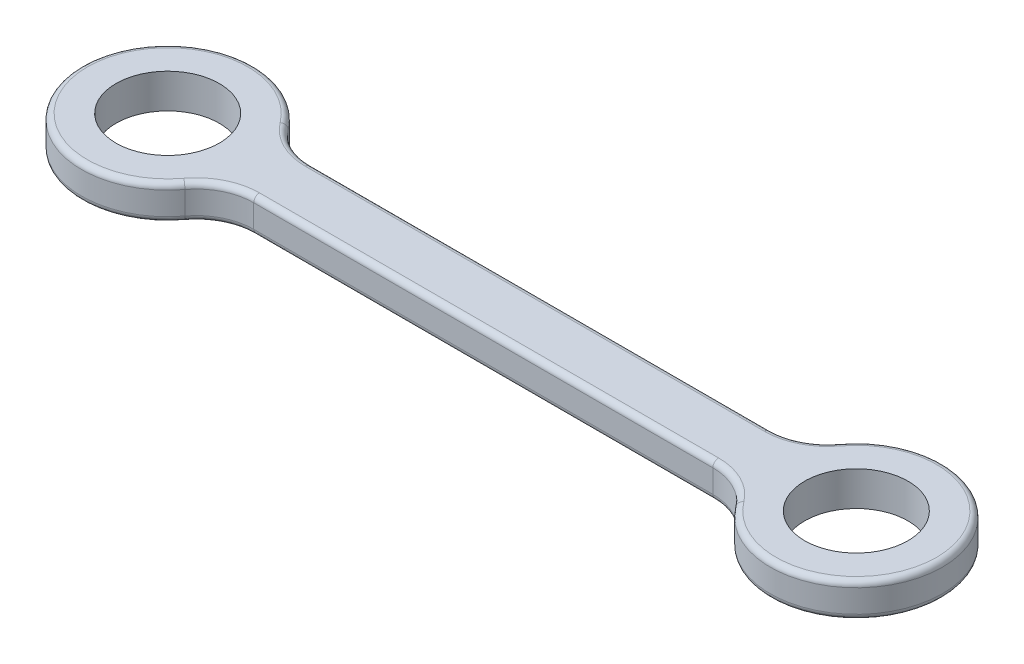
ISO-10303-21;
HEADER;
FILE_DESCRIPTION(('STEP AP214'),'2;1');
FILE_NAME('part.step','',(''),(''),'','','');
FILE_SCHEMA(('AUTOMOTIVE_DESIGN { 1 0 10303 214 1 1 1 1 }'));
ENDSEC;
DATA;
#1=APPLICATION_CONTEXT('core data for automotive mechanical design processes');
#2=APPLICATION_PROTOCOL_DEFINITION('international standard','automotive_design',2000,#1);
#3=PRODUCT_CONTEXT('',#1,'mechanical');
#4=PRODUCT('Part','Part','',(#3));
#5=PRODUCT_RELATED_PRODUCT_CATEGORY('part','',(#4));
#6=PRODUCT_DEFINITION_FORMATION('','',#4);
#7=PRODUCT_DEFINITION_CONTEXT('part definition',#1,'design');
#8=PRODUCT_DEFINITION('design','',#6,#7);
#9=PRODUCT_DEFINITION_SHAPE('','',#8);
#10=(LENGTH_UNIT() NAMED_UNIT(*) SI_UNIT(.MILLI.,.METRE.));
#11=(NAMED_UNIT(*) PLANE_ANGLE_UNIT() SI_UNIT($,.RADIAN.));
#12=(NAMED_UNIT(*) SI_UNIT($,.STERADIAN.) SOLID_ANGLE_UNIT());
#13=UNCERTAINTY_MEASURE_WITH_UNIT(LENGTH_MEASURE(1.E-05),#10,'distance_accuracy_value','');
#14=(GEOMETRIC_REPRESENTATION_CONTEXT(3) GLOBAL_UNCERTAINTY_ASSIGNED_CONTEXT((#13)) GLOBAL_UNIT_ASSIGNED_CONTEXT((#10,
#11,#12)) REPRESENTATION_CONTEXT('',''));
#15=CARTESIAN_POINT('',(0.,0.,0.));
#16=DIRECTION('',(0.,0.,1.));
#17=DIRECTION('',(1.,0.,0.));
#18=AXIS2_PLACEMENT_3D('',#15,#16,#17);
#19=CARTESIAN_POINT('',(51.9540229885057,6.,-15.));
#20=DIRECTION('',(0.,-1.,0.));
#21=DIRECTION('',(0.,0.,-1.));
#22=AXIS2_PLACEMENT_3D('',#19,#20,#21);
#23=PLANE('',#22);
#24=CARTESIAN_POINT('',(-48.0459770114942,6.,0.));
#25=DIRECTION('',(0.,-1.,0.));
#26=DIRECTION('',(0.,0.,-1.));
#27=AXIS2_PLACEMENT_3D('',#24,#25,#26);
#28=CIRCLE('',#27,14.);
#29=CARTESIAN_POINT('',(-36.8459770114942,6.,-8.4));
#30=VERTEX_POINT('',#29);
#31=CARTESIAN_POINT('',(-36.8459770114942,6.,8.4));
#32=VERTEX_POINT('',#31);
#33=EDGE_CURVE('E57',#30,#32,#28,.F.);
#34=ORIENTED_EDGE('',*,*,#33,.T.);
#35=CARTESIAN_POINT('',(-28.0459770114942,6.,15.));
#36=DIRECTION('',(0.,-1.,0.));
#37=DIRECTION('',(0.,0.,-1.));
#38=AXIS2_PLACEMENT_3D('',#35,#36,#37);
#39=CIRCLE('',#38,11.);
#40=CARTESIAN_POINT('',(-28.0459770114942,6.,4.));
#41=VERTEX_POINT('',#40);
#42=EDGE_CURVE('E159',#32,#41,#39,.T.);
#43=ORIENTED_EDGE('',*,*,#42,.T.);
#44=DIRECTION('',(1.,0.,0.));
#45=VECTOR('',#44,1.);
#46=CARTESIAN_POINT('',(51.9540229885057,6.,4.));
#47=LINE('',#46,#45);
#48=CARTESIAN_POINT('',(51.9540229885057,6.,4.));
#49=VERTEX_POINT('',#48);
#50=EDGE_CURVE('E267',#41,#49,#47,.T.);
#51=ORIENTED_EDGE('',*,*,#50,.T.);
#52=CARTESIAN_POINT('',(51.9540229885057,6.,15.));
#53=DIRECTION('',(0.,-1.,0.));
#54=DIRECTION('',(0.,0.,-1.));
#55=AXIS2_PLACEMENT_3D('',#52,#53,#54);
#56=CIRCLE('',#55,11.);
#57=CARTESIAN_POINT('',(60.7540229885058,6.,8.4));
#58=VERTEX_POINT('',#57);
#59=EDGE_CURVE('E270',#49,#58,#56,.T.);
#60=ORIENTED_EDGE('',*,*,#59,.T.);
#61=CARTESIAN_POINT('',(71.9540229885058,6.,0.));
#62=DIRECTION('',(0.,-1.,0.));
#63=DIRECTION('',(0.,0.,-1.));
#64=AXIS2_PLACEMENT_3D('',#61,#62,#63);
#65=CIRCLE('',#64,14.);
#66=CARTESIAN_POINT('',(60.7540229885058,6.,-8.4));
#67=VERTEX_POINT('',#66);
#68=EDGE_CURVE('E273',#58,#67,#65,.F.);
#69=ORIENTED_EDGE('',*,*,#68,.T.);
#70=CARTESIAN_POINT('',(51.9540229885057,6.,-15.));
#71=DIRECTION('',(0.,-1.,0.));
#72=DIRECTION('',(0.,0.,-1.));
#73=AXIS2_PLACEMENT_3D('',#70,#71,#72);
#74=CIRCLE('',#73,11.);
#75=CARTESIAN_POINT('',(51.9540229885057,6.,-4.));
#76=VERTEX_POINT('',#75);
#77=EDGE_CURVE('E276',#67,#76,#74,.T.);
#78=ORIENTED_EDGE('',*,*,#77,.T.);
#79=DIRECTION('',(-1.,0.,0.));
#80=VECTOR('',#79,1.);
#81=CARTESIAN_POINT('',(51.9540229885057,6.,-4.));
#82=LINE('',#81,#80);
#83=CARTESIAN_POINT('',(-28.0459770114942,6.,-4.));
#84=VERTEX_POINT('',#83);
#85=EDGE_CURVE('E279',#76,#84,#82,.T.);
#86=ORIENTED_EDGE('',*,*,#85,.T.);
#87=CARTESIAN_POINT('',(-28.0459770114942,6.,-15.));
#88=DIRECTION('',(0.,-1.,0.));
#89=DIRECTION('',(0.,0.,-1.));
#90=AXIS2_PLACEMENT_3D('',#87,#88,#89);
#91=CIRCLE('',#90,11.);
#92=EDGE_CURVE('E62',#84,#30,#91,.T.);
#93=ORIENTED_EDGE('',*,*,#92,.T.);
#94=EDGE_LOOP('',(#34,#43,#51,#60,#69,#78,#86,#93));
#95=FACE_BOUND('',#94,.T.);
#96=CARTESIAN_POINT('',(-48.0459770114942,6.,0.));
#97=DIRECTION('',(0.,1.,0.));
#98=DIRECTION('',(0.,0.,1.));
#99=AXIS2_PLACEMENT_3D('',#96,#97,#98);
#100=CIRCLE('',#99,9.);
#101=CARTESIAN_POINT('',(-48.0459770114942,6.,9.));
#102=VERTEX_POINT('',#101);
#103=EDGE_CURVE('E367',#102,#102,#100,.T.);
#104=ORIENTED_EDGE('',*,*,#103,.F.);
#105=EDGE_LOOP('',(#104));
#106=FACE_BOUND('',#105,.T.);
#107=CARTESIAN_POINT('',(71.9540229885058,6.,0.));
#108=DIRECTION('',(0.,1.,0.));
#109=DIRECTION('',(0.,0.,1.));
#110=AXIS2_PLACEMENT_3D('',#107,#108,#109);
#111=CIRCLE('',#110,9.);
#112=CARTESIAN_POINT('',(71.9540229885058,6.,9.));
#113=VERTEX_POINT('',#112);
#114=EDGE_CURVE('E443',#113,#113,#111,.T.);
#115=ORIENTED_EDGE('',*,*,#114,.F.);
#116=EDGE_LOOP('',(#115));
#117=FACE_BOUND('',#116,.T.);
#118=ADVANCED_FACE('F39',(#95,#106,#117),#23,.F.);
#119=CARTESIAN_POINT('',(51.9540229885057,0.,-15.));
#120=DIRECTION('',(0.,-1.,0.));
#121=DIRECTION('',(0.,0.,-1.));
#122=AXIS2_PLACEMENT_3D('',#119,#120,#121);
#123=PLANE('',#122);
#124=CARTESIAN_POINT('',(-28.0459770114942,0.,15.));
#125=DIRECTION('',(0.,-1.,0.));
#126=DIRECTION('',(0.,0.,-1.));
#127=AXIS2_PLACEMENT_3D('',#124,#125,#126);
#128=CIRCLE('',#127,11.);
#129=CARTESIAN_POINT('',(-28.0459770114942,0.,4.));
#130=VERTEX_POINT('',#129);
#131=CARTESIAN_POINT('',(-36.8459770114942,0.,8.4));
#132=VERTEX_POINT('',#131);
#133=EDGE_CURVE('E206',#130,#132,#128,.F.);
#134=ORIENTED_EDGE('',*,*,#133,.T.);
#135=CARTESIAN_POINT('',(-48.0459770114942,0.,0.));
#136=DIRECTION('',(0.,-1.,0.));
#137=DIRECTION('',(0.,0.,-1.));
#138=AXIS2_PLACEMENT_3D('',#135,#136,#137);
#139=CIRCLE('',#138,14.);
#140=CARTESIAN_POINT('',(-36.8459770114942,0.,-8.39999999999999));
#141=VERTEX_POINT('',#140);
#142=EDGE_CURVE('E227',#132,#141,#139,.T.);
#143=ORIENTED_EDGE('',*,*,#142,.T.);
#144=CARTESIAN_POINT('',(-28.0459770114942,0.,-15.));
#145=DIRECTION('',(0.,-1.,0.));
#146=DIRECTION('',(0.,0.,-1.));
#147=AXIS2_PLACEMENT_3D('',#144,#145,#146);
#148=CIRCLE('',#147,11.);
#149=CARTESIAN_POINT('',(-28.0459770114942,0.,-4.));
#150=VERTEX_POINT('',#149);
#151=EDGE_CURVE('E224',#141,#150,#148,.F.);
#152=ORIENTED_EDGE('',*,*,#151,.T.);
#153=DIRECTION('',(-1.,0.,0.));
#154=VECTOR('',#153,1.);
#155=CARTESIAN_POINT('',(51.9540229885057,0.,-4.));
#156=LINE('',#155,#154);
#157=CARTESIAN_POINT('',(51.9540229885057,0.,-4.));
#158=VERTEX_POINT('',#157);
#159=EDGE_CURVE('E221',#150,#158,#156,.F.);
#160=ORIENTED_EDGE('',*,*,#159,.T.);
#161=CARTESIAN_POINT('',(51.9540229885057,0.,-15.));
#162=DIRECTION('',(0.,-1.,0.));
#163=DIRECTION('',(0.,0.,-1.));
#164=AXIS2_PLACEMENT_3D('',#161,#162,#163);
#165=CIRCLE('',#164,11.);
#166=CARTESIAN_POINT('',(60.7540229885058,0.,-8.4));
#167=VERTEX_POINT('',#166);
#168=EDGE_CURVE('E218',#158,#167,#165,.F.);
#169=ORIENTED_EDGE('',*,*,#168,.T.);
#170=CARTESIAN_POINT('',(71.9540229885058,0.,0.));
#171=DIRECTION('',(0.,-1.,0.));
#172=DIRECTION('',(0.,0.,-1.));
#173=AXIS2_PLACEMENT_3D('',#170,#171,#172);
#174=CIRCLE('',#173,14.);
#175=CARTESIAN_POINT('',(60.7540229885058,0.,8.4));
#176=VERTEX_POINT('',#175);
#177=EDGE_CURVE('E215',#167,#176,#174,.T.);
#178=ORIENTED_EDGE('',*,*,#177,.T.);
#179=CARTESIAN_POINT('',(51.9540229885057,0.,15.));
#180=DIRECTION('',(0.,-1.,0.));
#181=DIRECTION('',(0.,0.,-1.));
#182=AXIS2_PLACEMENT_3D('',#179,#180,#181);
#183=CIRCLE('',#182,11.);
#184=CARTESIAN_POINT('',(51.9540229885057,0.,4.));
#185=VERTEX_POINT('',#184);
#186=EDGE_CURVE('E212',#176,#185,#183,.F.);
#187=ORIENTED_EDGE('',*,*,#186,.T.);
#188=DIRECTION('',(1.,0.,0.));
#189=VECTOR('',#188,1.);
#190=CARTESIAN_POINT('',(-28.0459770114942,0.,4.));
#191=LINE('',#190,#189);
#192=EDGE_CURVE('E209',#185,#130,#191,.F.);
#193=ORIENTED_EDGE('',*,*,#192,.T.);
#194=EDGE_LOOP('',(#134,#143,#152,#160,#169,#178,#187,#193));
#195=FACE_BOUND('',#194,.T.);
#196=CARTESIAN_POINT('',(-48.0459770114942,0.,0.));
#197=DIRECTION('',(0.,1.,0.));
#198=DIRECTION('',(0.,0.,1.));
#199=AXIS2_PLACEMENT_3D('',#196,#197,#198);
#200=CIRCLE('',#199,9.);
#201=CARTESIAN_POINT('',(-48.0459770114942,0.,9.));
#202=VERTEX_POINT('',#201);
#203=EDGE_CURVE('E373',#202,#202,#200,.T.);
#204=ORIENTED_EDGE('',*,*,#203,.T.);
#205=EDGE_LOOP('',(#204));
#206=FACE_BOUND('',#205,.T.);
#207=CARTESIAN_POINT('',(71.9540229885058,0.,0.));
#208=DIRECTION('',(0.,1.,0.));
#209=DIRECTION('',(0.,0.,1.));
#210=AXIS2_PLACEMENT_3D('',#207,#208,#209);
#211=CIRCLE('',#210,9.);
#212=CARTESIAN_POINT('',(71.9540229885058,0.,9.));
#213=VERTEX_POINT('',#212);
#214=EDGE_CURVE('E320',#213,#213,#211,.T.);
#215=ORIENTED_EDGE('',*,*,#214,.T.);
#216=EDGE_LOOP('',(#215));
#217=FACE_BOUND('',#216,.T.);
#218=ADVANCED_FACE('F397',(#195,#206,#217),#123,.T.);
#219=CARTESIAN_POINT('',(51.9540229885057,6.,-15.));
#220=DIRECTION('',(0.,-1.,0.));
#221=DIRECTION('',(0.,0.,-1.));
#222=AXIS2_PLACEMENT_3D('',#219,#220,#221);
#223=CYLINDRICAL_SURFACE('',#222,10.);
#224=DIRECTION('',(0.,-1.,0.));
#225=VECTOR('',#224,1.);
#226=CARTESIAN_POINT('',(59.9540229885058,6.,-9.));
#227=LINE('',#226,#225);
#228=CARTESIAN_POINT('',(59.9540229885058,5.,-9.));
#229=VERTEX_POINT('',#228);
#230=CARTESIAN_POINT('',(59.9540229885058,1.,-9.));
#231=VERTEX_POINT('',#230);
#232=EDGE_CURVE('E358',#229,#231,#227,.T.);
#233=ORIENTED_EDGE('',*,*,#232,.T.);
#234=CARTESIAN_POINT('',(51.9540229885057,1.,-15.));
#235=DIRECTION('',(0.,-1.,0.));
#236=DIRECTION('',(0.,0.,-1.));
#237=AXIS2_PLACEMENT_3D('',#234,#235,#236);
#238=CIRCLE('',#237,10.);
#239=CARTESIAN_POINT('',(51.9540229885057,1.,-5.));
#240=VERTEX_POINT('',#239);
#241=EDGE_CURVE('E246',#231,#240,#238,.T.);
#242=ORIENTED_EDGE('',*,*,#241,.T.);
#243=DIRECTION('',(0.,-1.,0.));
#244=VECTOR('',#243,1.);
#245=CARTESIAN_POINT('',(51.9540229885057,6.,-5.));
#246=LINE('',#245,#244);
#247=CARTESIAN_POINT('',(51.9540229885057,5.,-5.));
#248=VERTEX_POINT('',#247);
#249=EDGE_CURVE('E175',#248,#240,#246,.T.);
#250=ORIENTED_EDGE('',*,*,#249,.F.);
#251=CARTESIAN_POINT('',(51.9540229885057,5.,-15.));
#252=DIRECTION('',(0.,-1.,0.));
#253=DIRECTION('',(0.,0.,-1.));
#254=AXIS2_PLACEMENT_3D('',#251,#252,#253);
#255=CIRCLE('',#254,10.);
#256=EDGE_CURVE('E243',#248,#229,#255,.F.);
#257=ORIENTED_EDGE('',*,*,#256,.T.);
#258=EDGE_LOOP('',(#233,#242,#250,#257));
#259=FACE_BOUND('',#258,.T.);
#260=ADVANCED_FACE('F357',(#259),#223,.F.);
#261=CARTESIAN_POINT('',(-28.0459770114942,6.,-5.));
#262=DIRECTION('',(0.,0.,1.));
#263=DIRECTION('',(1.,0.,0.));
#264=AXIS2_PLACEMENT_3D('',#261,#262,#263);
#265=PLANE('',#264);
#266=ORIENTED_EDGE('',*,*,#249,.T.);
#267=DIRECTION('',(-1.,0.,0.));
#268=VECTOR('',#267,1.);
#269=CARTESIAN_POINT('',(-28.0459770114942,1.,-5.));
#270=LINE('',#269,#268);
#271=CARTESIAN_POINT('',(-28.0459770114942,1.,-4.99999999999999));
#272=VERTEX_POINT('',#271);
#273=EDGE_CURVE('E240',#240,#272,#270,.T.);
#274=ORIENTED_EDGE('',*,*,#273,.T.);
#275=DIRECTION('',(0.,-1.,0.));
#276=VECTOR('',#275,1.);
#277=CARTESIAN_POINT('',(-28.0459770114942,6.,-4.99999999999999));
#278=LINE('',#277,#276);
#279=CARTESIAN_POINT('',(-28.0459770114942,5.,-4.99999999999999));
#280=VERTEX_POINT('',#279);
#281=EDGE_CURVE('E192',#280,#272,#278,.T.);
#282=ORIENTED_EDGE('',*,*,#281,.F.);
#283=DIRECTION('',(-1.,0.,0.));
#284=VECTOR('',#283,1.);
#285=CARTESIAN_POINT('',(-28.0459770114942,5.,-5.));
#286=LINE('',#285,#284);
#287=EDGE_CURVE('E237',#280,#248,#286,.F.);
#288=ORIENTED_EDGE('',*,*,#287,.T.);
#289=EDGE_LOOP('',(#266,#274,#282,#288));
#290=FACE_BOUND('',#289,.T.);
#291=ADVANCED_FACE('F410',(#290),#265,.F.);
#292=CARTESIAN_POINT('',(-28.0459770114942,6.,-15.));
#293=DIRECTION('',(0.,-1.,0.));
#294=DIRECTION('',(0.,0.,-1.));
#295=AXIS2_PLACEMENT_3D('',#292,#293,#294);
#296=CYLINDRICAL_SURFACE('',#295,10.);
#297=ORIENTED_EDGE('',*,*,#281,.T.);
#298=CARTESIAN_POINT('',(-28.0459770114942,1.,-15.));
#299=DIRECTION('',(0.,-1.,0.));
#300=DIRECTION('',(0.,0.,-1.));
#301=AXIS2_PLACEMENT_3D('',#298,#299,#300);
#302=CIRCLE('',#301,10.);
#303=CARTESIAN_POINT('',(-36.0459770114942,1.,-9.));
#304=VERTEX_POINT('',#303);
#305=EDGE_CURVE('E234',#272,#304,#302,.T.);
#306=ORIENTED_EDGE('',*,*,#305,.T.);
#307=DIRECTION('',(0.,-1.,0.));
#308=VECTOR('',#307,1.);
#309=CARTESIAN_POINT('',(-36.0459770114942,6.,-9.));
#310=LINE('',#309,#308);
#311=CARTESIAN_POINT('',(-36.0459770114942,5.,-9.));
#312=VERTEX_POINT('',#311);
#313=EDGE_CURVE('E188',#312,#304,#310,.T.);
#314=ORIENTED_EDGE('',*,*,#313,.F.);
#315=CARTESIAN_POINT('',(-28.0459770114942,5.,-15.));
#316=DIRECTION('',(0.,-1.,0.));
#317=DIRECTION('',(0.,0.,-1.));
#318=AXIS2_PLACEMENT_3D('',#315,#316,#317);
#319=CIRCLE('',#318,10.);
#320=EDGE_CURVE('E231',#312,#280,#319,.F.);
#321=ORIENTED_EDGE('',*,*,#320,.T.);
#322=EDGE_LOOP('',(#297,#306,#314,#321));
#323=FACE_BOUND('',#322,.T.);
#324=ADVANCED_FACE('F414',(#323),#296,.F.);
#325=CARTESIAN_POINT('',(-48.0459770114942,6.,0.));
#326=DIRECTION('',(0.,-1.,0.));
#327=DIRECTION('',(0.,0.,-1.));
#328=AXIS2_PLACEMENT_3D('',#325,#326,#327);
#329=CYLINDRICAL_SURFACE('',#328,15.);
#330=ORIENTED_EDGE('',*,*,#313,.T.);
#331=CARTESIAN_POINT('',(-48.0459770114942,1.,0.));
#332=DIRECTION('',(0.,-1.,0.));
#333=DIRECTION('',(0.,0.,-1.));
#334=AXIS2_PLACEMENT_3D('',#331,#332,#333);
#335=CIRCLE('',#334,15.);
#336=CARTESIAN_POINT('',(-36.0459770114942,1.,9.));
#337=VERTEX_POINT('',#336);
#338=EDGE_CURVE('E174',#304,#337,#335,.F.);
#339=ORIENTED_EDGE('',*,*,#338,.T.);
#340=DIRECTION('',(0.,-1.,0.));
#341=VECTOR('',#340,1.);
#342=CARTESIAN_POINT('',(-36.0459770114942,6.,9.));
#343=LINE('',#342,#341);
#344=CARTESIAN_POINT('',(-36.0459770114942,5.,9.));
#345=VERTEX_POINT('',#344);
#346=EDGE_CURVE('E181',#345,#337,#343,.T.);
#347=ORIENTED_EDGE('',*,*,#346,.F.);
#348=CARTESIAN_POINT('',(-48.0459770114942,5.,0.));
#349=DIRECTION('',(0.,-1.,0.));
#350=DIRECTION('',(0.,0.,-1.));
#351=AXIS2_PLACEMENT_3D('',#348,#349,#350);
#352=CIRCLE('',#351,15.);
#353=EDGE_CURVE('E166',#345,#312,#352,.T.);
#354=ORIENTED_EDGE('',*,*,#353,.T.);
#355=EDGE_LOOP('',(#330,#339,#347,#354));
#356=FACE_BOUND('',#355,.T.);
#357=ADVANCED_FACE('F185',(#356),#329,.T.);
#358=CARTESIAN_POINT('',(-28.0459770114942,6.,15.));
#359=DIRECTION('',(0.,-1.,0.));
#360=DIRECTION('',(0.,0.,-1.));
#361=AXIS2_PLACEMENT_3D('',#358,#359,#360);
#362=CYLINDRICAL_SURFACE('',#361,10.);
#363=DIRECTION('',(0.,-1.,0.));
#364=VECTOR('',#363,1.);
#365=CARTESIAN_POINT('',(-28.0459770114942,6.,5.));
#366=LINE('',#365,#364);
#367=CARTESIAN_POINT('',(-28.0459770114942,5.,5.));
#368=VERTEX_POINT('',#367);
#369=CARTESIAN_POINT('',(-28.0459770114942,1.,5.));
#370=VERTEX_POINT('',#369);
#371=EDGE_CURVE('E183',#368,#370,#366,.T.);
#372=ORIENTED_EDGE('',*,*,#371,.F.);
#373=CARTESIAN_POINT('',(-28.0459770114942,5.,15.));
#374=DIRECTION('',(0.,-1.,0.));
#375=DIRECTION('',(0.,0.,-1.));
#376=AXIS2_PLACEMENT_3D('',#373,#374,#375);
#377=CIRCLE('',#376,10.);
#378=EDGE_CURVE('E11',#368,#345,#377,.F.);
#379=ORIENTED_EDGE('',*,*,#378,.T.);
#380=ORIENTED_EDGE('',*,*,#346,.T.);
#381=CARTESIAN_POINT('',(-28.0459770114942,1.,15.));
#382=DIRECTION('',(0.,-1.,0.));
#383=DIRECTION('',(0.,0.,-1.));
#384=AXIS2_PLACEMENT_3D('',#381,#382,#383);
#385=CIRCLE('',#384,10.);
#386=EDGE_CURVE('E49',#337,#370,#385,.T.);
#387=ORIENTED_EDGE('',*,*,#386,.T.);
#388=EDGE_LOOP('',(#372,#379,#380,#387));
#389=FACE_BOUND('',#388,.T.);
#390=ADVANCED_FACE('F180',(#389),#362,.F.);
#391=CARTESIAN_POINT('',(-28.0459770114942,6.,5.));
#392=DIRECTION('',(0.,0.,-1.));
#393=DIRECTION('',(-1.,0.,0.));
#394=AXIS2_PLACEMENT_3D('',#391,#392,#393);
#395=PLANE('',#394);
#396=ORIENTED_EDGE('',*,*,#371,.T.);
#397=DIRECTION('',(1.,0.,0.));
#398=VECTOR('',#397,1.);
#399=CARTESIAN_POINT('',(51.9540229885057,1.,5.));
#400=LINE('',#399,#398);
#401=CARTESIAN_POINT('',(51.9540229885057,1.,5.));
#402=VERTEX_POINT('',#401);
#403=EDGE_CURVE('E264',#370,#402,#400,.T.);
#404=ORIENTED_EDGE('',*,*,#403,.T.);
#405=DIRECTION('',(0.,-1.,0.));
#406=VECTOR('',#405,1.);
#407=CARTESIAN_POINT('',(51.9540229885057,6.,5.));
#408=LINE('',#407,#406);
#409=CARTESIAN_POINT('',(51.9540229885057,5.,5.));
#410=VERTEX_POINT('',#409);
#411=EDGE_CURVE('E194',#410,#402,#408,.T.);
#412=ORIENTED_EDGE('',*,*,#411,.F.);
#413=DIRECTION('',(1.,0.,0.));
#414=VECTOR('',#413,1.);
#415=CARTESIAN_POINT('',(-28.0459770114942,5.,5.));
#416=LINE('',#415,#414);
#417=EDGE_CURVE('E261',#410,#368,#416,.F.);
#418=ORIENTED_EDGE('',*,*,#417,.T.);
#419=EDGE_LOOP('',(#396,#404,#412,#418));
#420=FACE_BOUND('',#419,.T.);
#421=ADVANCED_FACE('F430',(#420),#395,.F.);
#422=CARTESIAN_POINT('',(51.9540229885057,6.,15.));
#423=DIRECTION('',(0.,-1.,0.));
#424=DIRECTION('',(0.,0.,-1.));
#425=AXIS2_PLACEMENT_3D('',#422,#423,#424);
#426=CYLINDRICAL_SURFACE('',#425,10.);
#427=ORIENTED_EDGE('',*,*,#411,.T.);
#428=CARTESIAN_POINT('',(51.9540229885057,1.,15.));
#429=DIRECTION('',(0.,-1.,0.));
#430=DIRECTION('',(0.,0.,-1.));
#431=AXIS2_PLACEMENT_3D('',#428,#429,#430);
#432=CIRCLE('',#431,10.);
#433=CARTESIAN_POINT('',(59.9540229885058,1.,8.99999999999999));
#434=VERTEX_POINT('',#433);
#435=EDGE_CURVE('E258',#402,#434,#432,.T.);
#436=ORIENTED_EDGE('',*,*,#435,.T.);
#437=DIRECTION('',(0.,-1.,0.));
#438=VECTOR('',#437,1.);
#439=CARTESIAN_POINT('',(59.9540229885058,6.,8.99999999999999));
#440=LINE('',#439,#438);
#441=CARTESIAN_POINT('',(59.9540229885058,5.,8.99999999999999));
#442=VERTEX_POINT('',#441);
#443=EDGE_CURVE('E366',#442,#434,#440,.T.);
#444=ORIENTED_EDGE('',*,*,#443,.F.);
#445=CARTESIAN_POINT('',(51.9540229885057,5.,15.));
#446=DIRECTION('',(0.,-1.,0.));
#447=DIRECTION('',(0.,0.,-1.));
#448=AXIS2_PLACEMENT_3D('',#445,#446,#447);
#449=CIRCLE('',#448,10.);
#450=EDGE_CURVE('E255',#442,#410,#449,.F.);
#451=ORIENTED_EDGE('',*,*,#450,.T.);
#452=EDGE_LOOP('',(#427,#436,#444,#451));
#453=FACE_BOUND('',#452,.T.);
#454=ADVANCED_FACE('F381',(#453),#426,.F.);
#455=CARTESIAN_POINT('',(71.9540229885058,6.,0.));
#456=DIRECTION('',(0.,-1.,0.));
#457=DIRECTION('',(0.,0.,-1.));
#458=AXIS2_PLACEMENT_3D('',#455,#456,#457);
#459=CYLINDRICAL_SURFACE('',#458,15.);
#460=ORIENTED_EDGE('',*,*,#443,.T.);
#461=CARTESIAN_POINT('',(71.9540229885058,1.,0.));
#462=DIRECTION('',(0.,-1.,0.));
#463=DIRECTION('',(0.,0.,-1.));
#464=AXIS2_PLACEMENT_3D('',#461,#462,#463);
#465=CIRCLE('',#464,15.);
#466=EDGE_CURVE('E252',#434,#231,#465,.F.);
#467=ORIENTED_EDGE('',*,*,#466,.T.);
#468=ORIENTED_EDGE('',*,*,#232,.F.);
#469=CARTESIAN_POINT('',(71.9540229885058,5.,0.));
#470=DIRECTION('',(0.,-1.,0.));
#471=DIRECTION('',(0.,0.,-1.));
#472=AXIS2_PLACEMENT_3D('',#469,#470,#471);
#473=CIRCLE('',#472,15.);
#474=EDGE_CURVE('E249',#229,#442,#473,.T.);
#475=ORIENTED_EDGE('',*,*,#474,.T.);
#476=EDGE_LOOP('',(#460,#467,#468,#475));
#477=FACE_BOUND('',#476,.T.);
#478=ADVANCED_FACE('F362',(#477),#459,.T.);
#479=CARTESIAN_POINT('',(-48.0459770114942,6.,0.));
#480=DIRECTION('',(0.,-1.,0.));
#481=DIRECTION('',(0.,0.,-1.));
#482=AXIS2_PLACEMENT_3D('',#479,#480,#481);
#483=CYLINDRICAL_SURFACE('',#482,9.);
#484=ORIENTED_EDGE('',*,*,#103,.T.);
#485=EDGE_LOOP('',(#484));
#486=FACE_BOUND('',#485,.T.);
#487=ORIENTED_EDGE('',*,*,#203,.F.);
#488=EDGE_LOOP('',(#487));
#489=FACE_BOUND('',#488,.T.);
#490=ADVANCED_FACE('F457',(#486,#489),#483,.F.);
#491=CARTESIAN_POINT('',(71.9540229885058,6.,0.));
#492=DIRECTION('',(0.,-1.,0.));
#493=DIRECTION('',(0.,0.,-1.));
#494=AXIS2_PLACEMENT_3D('',#491,#492,#493);
#495=CYLINDRICAL_SURFACE('',#494,9.);
#496=ORIENTED_EDGE('',*,*,#114,.T.);
#497=EDGE_LOOP('',(#496));
#498=FACE_BOUND('',#497,.T.);
#499=ORIENTED_EDGE('',*,*,#214,.F.);
#500=EDGE_LOOP('',(#499));
#501=FACE_BOUND('',#500,.T.);
#502=ADVANCED_FACE('F455',(#498,#501),#495,.F.);
#503=CARTESIAN_POINT('',(71.9540229885058,1.,0.));
#504=DIRECTION('',(0.,-1.,0.));
#505=DIRECTION('',(0.,0.,-1.));
#506=AXIS2_PLACEMENT_3D('',#503,#504,#505);
#507=TOROIDAL_SURFACE('',#506,14.,1.);
#508=CARTESIAN_POINT('',(60.7540229885058,1.,8.4));
#509=DIRECTION('',(-0.599999999999998,0.,-0.800000000000002));
#510=DIRECTION('',(-0.800000000000002,0.,0.599999999999998));
#511=AXIS2_PLACEMENT_3D('',#508,#509,#510);
#512=CIRCLE('',#511,1.);
#513=EDGE_CURVE('E312',#176,#434,#512,.T.);
#514=ORIENTED_EDGE('',*,*,#513,.F.);
#515=ORIENTED_EDGE('',*,*,#177,.F.);
#516=CARTESIAN_POINT('',(60.7540229885058,1.,-8.4));
#517=DIRECTION('',(-0.599999999999999,0.,0.800000000000001));
#518=DIRECTION('',(0.800000000000001,0.,0.599999999999999));
#519=AXIS2_PLACEMENT_3D('',#516,#517,#518);
#520=CIRCLE('',#519,1.);
#521=EDGE_CURVE('E316',#231,#167,#520,.T.);
#522=ORIENTED_EDGE('',*,*,#521,.F.);
#523=ORIENTED_EDGE('',*,*,#466,.F.);
#524=EDGE_LOOP('',(#514,#515,#522,#523));
#525=FACE_BOUND('',#524,.T.);
#526=ADVANCED_FACE('F403',(#525),#507,.T.);
#527=CARTESIAN_POINT('',(51.9540229885057,1.,-15.));
#528=DIRECTION('',(0.,-1.,0.));
#529=DIRECTION('',(0.,0.,-1.));
#530=AXIS2_PLACEMENT_3D('',#527,#528,#529);
#531=TOROIDAL_SURFACE('',#530,11.,1.);
#532=ORIENTED_EDGE('',*,*,#521,.T.);
#533=ORIENTED_EDGE('',*,*,#168,.F.);
#534=CARTESIAN_POINT('',(51.9540229885057,1.,-4.));
#535=DIRECTION('',(-1.,0.,0.));
#536=DIRECTION('',(0.,0.,1.));
#537=AXIS2_PLACEMENT_3D('',#534,#535,#536);
#538=CIRCLE('',#537,1.);
#539=EDGE_CURVE('E308',#240,#158,#538,.T.);
#540=ORIENTED_EDGE('',*,*,#539,.F.);
#541=ORIENTED_EDGE('',*,*,#241,.F.);
#542=EDGE_LOOP('',(#532,#533,#540,#541));
#543=FACE_BOUND('',#542,.T.);
#544=ADVANCED_FACE('F407',(#543),#531,.T.);
#545=CARTESIAN_POINT('',(51.9540229885057,1.,15.));
#546=DIRECTION('',(0.,-1.,0.));
#547=DIRECTION('',(0.,0.,-1.));
#548=AXIS2_PLACEMENT_3D('',#545,#546,#547);
#549=TOROIDAL_SURFACE('',#548,11.,1.);
#550=ORIENTED_EDGE('',*,*,#513,.T.);
#551=ORIENTED_EDGE('',*,*,#435,.F.);
#552=CARTESIAN_POINT('',(51.9540229885057,1.,4.));
#553=DIRECTION('',(-1.,0.,0.));
#554=DIRECTION('',(0.,0.,1.));
#555=AXIS2_PLACEMENT_3D('',#552,#553,#554);
#556=CIRCLE('',#555,1.);
#557=EDGE_CURVE('E304',#185,#402,#556,.T.);
#558=ORIENTED_EDGE('',*,*,#557,.F.);
#559=ORIENTED_EDGE('',*,*,#186,.F.);
#560=EDGE_LOOP('',(#550,#551,#558,#559));
#561=FACE_BOUND('',#560,.T.);
#562=ADVANCED_FACE('F387',(#561),#549,.T.);
#563=CARTESIAN_POINT('',(-28.0459770114942,1.,-4.));
#564=DIRECTION('',(1.,0.,0.));
#565=DIRECTION('',(0.,0.,-1.));
#566=AXIS2_PLACEMENT_3D('',#563,#564,#565);
#567=CYLINDRICAL_SURFACE('',#566,1.);
#568=ORIENTED_EDGE('',*,*,#539,.T.);
#569=ORIENTED_EDGE('',*,*,#159,.F.);
#570=CARTESIAN_POINT('',(-28.0459770114942,1.,-4.));
#571=DIRECTION('',(-1.,0.,0.));
#572=DIRECTION('',(0.,0.,1.));
#573=AXIS2_PLACEMENT_3D('',#570,#571,#572);
#574=CIRCLE('',#573,1.);
#575=EDGE_CURVE('E300',#272,#150,#574,.T.);
#576=ORIENTED_EDGE('',*,*,#575,.F.);
#577=ORIENTED_EDGE('',*,*,#273,.F.);
#578=EDGE_LOOP('',(#568,#569,#576,#577));
#579=FACE_BOUND('',#578,.T.);
#580=ADVANCED_FACE('F419',(#579),#567,.T.);
#581=CARTESIAN_POINT('',(-28.0459770114942,1.,4.));
#582=DIRECTION('',(-1.,0.,0.));
#583=DIRECTION('',(0.,0.,1.));
#584=AXIS2_PLACEMENT_3D('',#581,#582,#583);
#585=CYLINDRICAL_SURFACE('',#584,1.);
#586=ORIENTED_EDGE('',*,*,#557,.T.);
#587=ORIENTED_EDGE('',*,*,#403,.F.);
#588=CARTESIAN_POINT('',(-28.0459770114942,1.,4.));
#589=DIRECTION('',(-1.,0.,0.));
#590=DIRECTION('',(0.,0.,1.));
#591=AXIS2_PLACEMENT_3D('',#588,#589,#590);
#592=CIRCLE('',#591,1.);
#593=EDGE_CURVE('E296',#130,#370,#592,.T.);
#594=ORIENTED_EDGE('',*,*,#593,.F.);
#595=ORIENTED_EDGE('',*,*,#192,.F.);
#596=EDGE_LOOP('',(#586,#587,#594,#595));
#597=FACE_BOUND('',#596,.T.);
#598=ADVANCED_FACE('F393',(#597),#585,.T.);
#599=CARTESIAN_POINT('',(-28.0459770114942,1.,-15.));
#600=DIRECTION('',(0.,-1.,0.));
#601=DIRECTION('',(0.,0.,-1.));
#602=AXIS2_PLACEMENT_3D('',#599,#600,#601);
#603=TOROIDAL_SURFACE('',#602,11.,1.);
#604=ORIENTED_EDGE('',*,*,#575,.T.);
#605=ORIENTED_EDGE('',*,*,#151,.F.);
#606=CARTESIAN_POINT('',(-36.8459770114942,1.,-8.39999999999999));
#607=DIRECTION('',(-0.599999999999999,0.,-0.800000000000001));
#608=DIRECTION('',(-0.800000000000001,0.,0.599999999999999));
#609=AXIS2_PLACEMENT_3D('',#606,#607,#608);
#610=CIRCLE('',#609,1.);
#611=EDGE_CURVE('E293',#304,#141,#610,.T.);
#612=ORIENTED_EDGE('',*,*,#611,.F.);
#613=ORIENTED_EDGE('',*,*,#305,.F.);
#614=EDGE_LOOP('',(#604,#605,#612,#613));
#615=FACE_BOUND('',#614,.T.);
#616=ADVANCED_FACE('F423',(#615),#603,.T.);
#617=CARTESIAN_POINT('',(-28.0459770114942,1.,15.));
#618=DIRECTION('',(0.,-1.,0.));
#619=DIRECTION('',(0.,0.,-1.));
#620=AXIS2_PLACEMENT_3D('',#617,#618,#619);
#621=TOROIDAL_SURFACE('',#620,11.,1.);
#622=ORIENTED_EDGE('',*,*,#593,.T.);
#623=ORIENTED_EDGE('',*,*,#386,.F.);
#624=CARTESIAN_POINT('',(-36.8459770114942,1.,8.4));
#625=DIRECTION('',(-0.599999999999998,0.,0.800000000000002));
#626=DIRECTION('',(0.800000000000002,0.,0.599999999999998));
#627=AXIS2_PLACEMENT_3D('',#624,#625,#626);
#628=CIRCLE('',#627,1.);
#629=EDGE_CURVE('E290',#132,#337,#628,.T.);
#630=ORIENTED_EDGE('',*,*,#629,.F.);
#631=ORIENTED_EDGE('',*,*,#133,.F.);
#632=EDGE_LOOP('',(#622,#623,#630,#631));
#633=FACE_BOUND('',#632,.T.);
#634=ADVANCED_FACE('F429',(#633),#621,.T.);
#635=CARTESIAN_POINT('',(-48.0459770114942,1.,0.));
#636=DIRECTION('',(0.,-1.,0.));
#637=DIRECTION('',(0.,0.,-1.));
#638=AXIS2_PLACEMENT_3D('',#635,#636,#637);
#639=TOROIDAL_SURFACE('',#638,14.,1.);
#640=ORIENTED_EDGE('',*,*,#611,.T.);
#641=ORIENTED_EDGE('',*,*,#142,.F.);
#642=ORIENTED_EDGE('',*,*,#629,.T.);
#643=ORIENTED_EDGE('',*,*,#338,.F.);
#644=EDGE_LOOP('',(#640,#641,#642,#643));
#645=FACE_BOUND('',#644,.T.);
#646=ADVANCED_FACE('F425',(#645),#639,.T.);
#647=CARTESIAN_POINT('',(51.9540229885057,5.,-15.));
#648=DIRECTION('',(0.,-1.,0.));
#649=DIRECTION('',(0.,0.,-1.));
#650=AXIS2_PLACEMENT_3D('',#647,#648,#649);
#651=TOROIDAL_SURFACE('',#650,11.,1.);
#652=CARTESIAN_POINT('',(60.7540229885058,5.,-8.4));
#653=DIRECTION('',(0.599999999999999,0.,-0.800000000000001));
#654=DIRECTION('',(-0.800000000000001,0.,-0.599999999999999));
#655=AXIS2_PLACEMENT_3D('',#652,#653,#654);
#656=CIRCLE('',#655,1.);
#657=EDGE_CURVE('E335',#229,#67,#656,.T.);
#658=ORIENTED_EDGE('',*,*,#657,.F.);
#659=ORIENTED_EDGE('',*,*,#256,.F.);
#660=CARTESIAN_POINT('',(51.9540229885057,5.,-4.));
#661=DIRECTION('',(-1.,0.,0.));
#662=DIRECTION('',(0.,0.,1.));
#663=AXIS2_PLACEMENT_3D('',#660,#661,#662);
#664=CIRCLE('',#663,1.);
#665=EDGE_CURVE('E43',#76,#248,#664,.T.);
#666=ORIENTED_EDGE('',*,*,#665,.F.);
#667=ORIENTED_EDGE('',*,*,#77,.F.);
#668=EDGE_LOOP('',(#658,#659,#666,#667));
#669=FACE_BOUND('',#668,.T.);
#670=ADVANCED_FACE('F41',(#669),#651,.T.);
#671=CARTESIAN_POINT('',(51.9540229885057,5.,-4.));
#672=DIRECTION('',(-1.,0.,0.));
#673=DIRECTION('',(0.,0.,1.));
#674=AXIS2_PLACEMENT_3D('',#671,#672,#673);
#675=CYLINDRICAL_SURFACE('',#674,1.);
#676=ORIENTED_EDGE('',*,*,#665,.T.);
#677=ORIENTED_EDGE('',*,*,#287,.F.);
#678=CARTESIAN_POINT('',(-28.0459770114942,5.,-4.));
#679=DIRECTION('',(-1.,0.,0.));
#680=DIRECTION('',(0.,0.,1.));
#681=AXIS2_PLACEMENT_3D('',#678,#679,#680);
#682=CIRCLE('',#681,1.);
#683=EDGE_CURVE('E332',#84,#280,#682,.T.);
#684=ORIENTED_EDGE('',*,*,#683,.F.);
#685=ORIENTED_EDGE('',*,*,#85,.F.);
#686=EDGE_LOOP('',(#676,#677,#684,#685));
#687=FACE_BOUND('',#686,.T.);
#688=ADVANCED_FACE('F348',(#687),#675,.T.);
#689=CARTESIAN_POINT('',(71.9540229885058,5.,0.));
#690=DIRECTION('',(0.,-1.,0.));
#691=DIRECTION('',(0.,0.,-1.));
#692=AXIS2_PLACEMENT_3D('',#689,#690,#691);
#693=TOROIDAL_SURFACE('',#692,14.,1.);
#694=ORIENTED_EDGE('',*,*,#657,.T.);
#695=ORIENTED_EDGE('',*,*,#68,.F.);
#696=CARTESIAN_POINT('',(60.7540229885058,5.,8.4));
#697=DIRECTION('',(-0.599999999999999,0.,-0.800000000000001));
#698=DIRECTION('',(-0.800000000000001,0.,0.599999999999999));
#699=AXIS2_PLACEMENT_3D('',#696,#697,#698);
#700=CIRCLE('',#699,1.);
#701=EDGE_CURVE('E328',#442,#58,#700,.T.);
#702=ORIENTED_EDGE('',*,*,#701,.F.);
#703=ORIENTED_EDGE('',*,*,#474,.F.);
#704=EDGE_LOOP('',(#694,#695,#702,#703));
#705=FACE_BOUND('',#704,.T.);
#706=ADVANCED_FACE('F512',(#705),#693,.T.);
#707=CARTESIAN_POINT('',(-28.0459770114942,5.,-15.));
#708=DIRECTION('',(0.,-1.,0.));
#709=DIRECTION('',(0.,0.,-1.));
#710=AXIS2_PLACEMENT_3D('',#707,#708,#709);
#711=TOROIDAL_SURFACE('',#710,11.,1.);
#712=ORIENTED_EDGE('',*,*,#683,.T.);
#713=ORIENTED_EDGE('',*,*,#320,.F.);
#714=CARTESIAN_POINT('',(-36.8459770114942,5.,-8.4));
#715=DIRECTION('',(-0.599999999999998,0.,-0.800000000000002));
#716=DIRECTION('',(-0.800000000000002,0.,0.599999999999998));
#717=AXIS2_PLACEMENT_3D('',#714,#715,#716);
#718=CIRCLE('',#717,1.);
#719=EDGE_CURVE('E168',#30,#312,#718,.T.);
#720=ORIENTED_EDGE('',*,*,#719,.F.);
#721=ORIENTED_EDGE('',*,*,#92,.F.);
#722=EDGE_LOOP('',(#712,#713,#720,#721));
#723=FACE_BOUND('',#722,.T.);
#724=ADVANCED_FACE('F508',(#723),#711,.T.);
#725=CARTESIAN_POINT('',(51.9540229885057,5.,15.));
#726=DIRECTION('',(0.,-1.,0.));
#727=DIRECTION('',(0.,0.,-1.));
#728=AXIS2_PLACEMENT_3D('',#725,#726,#727);
#729=TOROIDAL_SURFACE('',#728,11.,1.);
#730=ORIENTED_EDGE('',*,*,#701,.T.);
#731=ORIENTED_EDGE('',*,*,#59,.F.);
#732=CARTESIAN_POINT('',(51.9540229885057,5.,4.));
#733=DIRECTION('',(-1.,0.,0.));
#734=DIRECTION('',(0.,0.,1.));
#735=AXIS2_PLACEMENT_3D('',#732,#733,#734);
#736=CIRCLE('',#735,1.);
#737=EDGE_CURVE('E162',#410,#49,#736,.T.);
#738=ORIENTED_EDGE('',*,*,#737,.F.);
#739=ORIENTED_EDGE('',*,*,#450,.F.);
#740=EDGE_LOOP('',(#730,#731,#738,#739));
#741=FACE_BOUND('',#740,.T.);
#742=ADVANCED_FACE('F505',(#741),#729,.T.);
#743=CARTESIAN_POINT('',(-48.0459770114942,5.,0.));
#744=DIRECTION('',(0.,-1.,0.));
#745=DIRECTION('',(0.,0.,-1.));
#746=AXIS2_PLACEMENT_3D('',#743,#744,#745);
#747=TOROIDAL_SURFACE('',#746,14.,1.);
#748=ORIENTED_EDGE('',*,*,#719,.T.);
#749=ORIENTED_EDGE('',*,*,#353,.F.);
#750=CARTESIAN_POINT('',(-36.8459770114942,5.,8.4));
#751=DIRECTION('',(0.600000000000001,0.,-0.799999999999999));
#752=DIRECTION('',(-0.799999999999999,0.,-0.600000000000001));
#753=AXIS2_PLACEMENT_3D('',#750,#751,#752);
#754=CIRCLE('',#753,1.);
#755=EDGE_CURVE('E155',#32,#345,#754,.T.);
#756=ORIENTED_EDGE('',*,*,#755,.F.);
#757=ORIENTED_EDGE('',*,*,#33,.F.);
#758=EDGE_LOOP('',(#748,#749,#756,#757));
#759=FACE_BOUND('',#758,.T.);
#760=ADVANCED_FACE('F167',(#759),#747,.T.);
#761=CARTESIAN_POINT('',(51.9540229885057,5.,4.));
#762=DIRECTION('',(1.,0.,0.));
#763=DIRECTION('',(0.,0.,-1.));
#764=AXIS2_PLACEMENT_3D('',#761,#762,#763);
#765=CYLINDRICAL_SURFACE('',#764,1.);
#766=ORIENTED_EDGE('',*,*,#737,.T.);
#767=ORIENTED_EDGE('',*,*,#50,.F.);
#768=CARTESIAN_POINT('',(-28.0459770114942,5.,4.));
#769=DIRECTION('',(-1.,0.,0.));
#770=DIRECTION('',(0.,0.,1.));
#771=AXIS2_PLACEMENT_3D('',#768,#769,#770);
#772=CIRCLE('',#771,1.);
#773=EDGE_CURVE('E163',#368,#41,#772,.T.);
#774=ORIENTED_EDGE('',*,*,#773,.F.);
#775=ORIENTED_EDGE('',*,*,#417,.F.);
#776=EDGE_LOOP('',(#766,#767,#774,#775));
#777=FACE_BOUND('',#776,.T.);
#778=ADVANCED_FACE('F433',(#777),#765,.T.);
#779=CARTESIAN_POINT('',(-28.0459770114942,5.,15.));
#780=DIRECTION('',(0.,-1.,0.));
#781=DIRECTION('',(0.,0.,-1.));
#782=AXIS2_PLACEMENT_3D('',#779,#780,#781);
#783=TOROIDAL_SURFACE('',#782,11.,1.);
#784=ORIENTED_EDGE('',*,*,#755,.T.);
#785=ORIENTED_EDGE('',*,*,#378,.F.);
#786=ORIENTED_EDGE('',*,*,#773,.T.);
#787=ORIENTED_EDGE('',*,*,#42,.F.);
#788=EDGE_LOOP('',(#784,#785,#786,#787));
#789=FACE_BOUND('',#788,.T.);
#790=ADVANCED_FACE('F157',(#789),#783,.T.);
#791=CLOSED_SHELL('',(#118,#218,#260,#291,#324,#357,#390,#421,#454,#478,#490,#502,#526,#544,
#562,#580,#598,#616,#634,#646,#670,#688,#706,#724,#742,#760,#778,#790));
#792=MANIFOLD_SOLID_BREP('B2',#791);
#793=ADVANCED_BREP_SHAPE_REPRESENTATION('',(#18,#792),#14);
#794=SHAPE_DEFINITION_REPRESENTATION(#9,#793);
ENDSEC;
END-ISO-10303-21;
